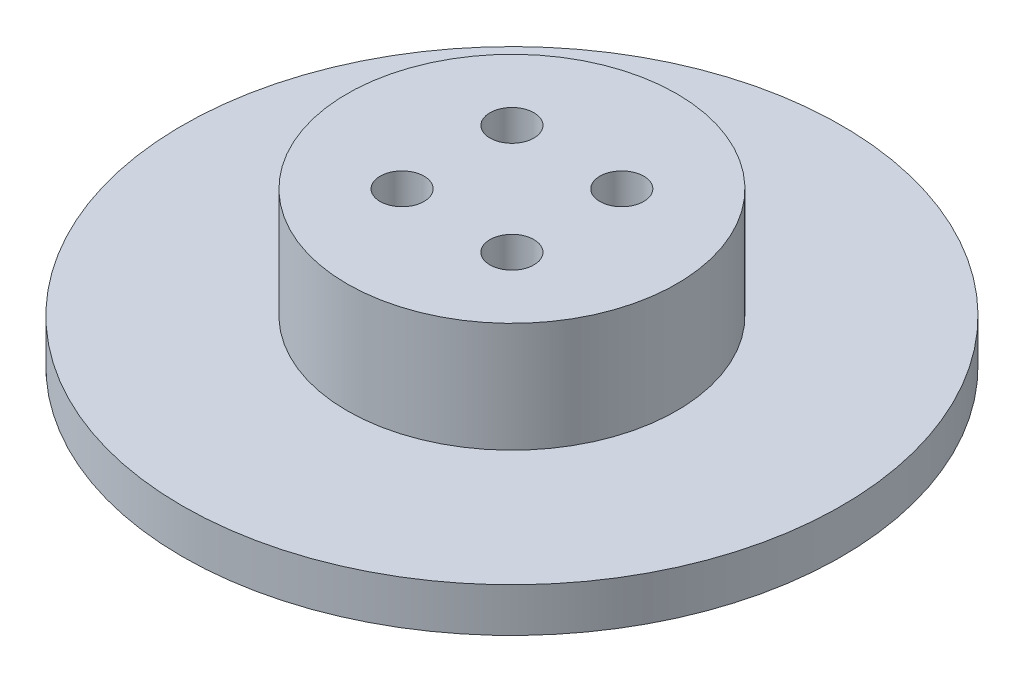
ISO-10303-21;
HEADER;
FILE_DESCRIPTION(('STEP AP214'),'2;1');
FILE_NAME('part.step','',(''),(''),'','','');
FILE_SCHEMA(('AUTOMOTIVE_DESIGN { 1 0 10303 214 1 1 1 1 }'));
ENDSEC;
DATA;
#1=APPLICATION_CONTEXT('core data for automotive mechanical design processes');
#2=APPLICATION_PROTOCOL_DEFINITION('international standard','automotive_design',2000,#1);
#3=PRODUCT_CONTEXT('',#1,'mechanical');
#4=PRODUCT('Part','Part','',(#3));
#5=PRODUCT_RELATED_PRODUCT_CATEGORY('part','',(#4));
#6=PRODUCT_DEFINITION_FORMATION('','',#4);
#7=PRODUCT_DEFINITION_CONTEXT('part definition',#1,'design');
#8=PRODUCT_DEFINITION('design','',#6,#7);
#9=PRODUCT_DEFINITION_SHAPE('','',#8);
#10=(LENGTH_UNIT() NAMED_UNIT(*) SI_UNIT(.MILLI.,.METRE.));
#11=(NAMED_UNIT(*) PLANE_ANGLE_UNIT() SI_UNIT($,.RADIAN.));
#12=(NAMED_UNIT(*) SI_UNIT($,.STERADIAN.) SOLID_ANGLE_UNIT());
#13=UNCERTAINTY_MEASURE_WITH_UNIT(LENGTH_MEASURE(1.E-05),#10,'distance_accuracy_value','');
#14=(GEOMETRIC_REPRESENTATION_CONTEXT(3) GLOBAL_UNCERTAINTY_ASSIGNED_CONTEXT((#13)) GLOBAL_UNIT_ASSIGNED_CONTEXT((#10,
#11,#12)) REPRESENTATION_CONTEXT('',''));
#15=CARTESIAN_POINT('',(0.,0.,0.));
#16=DIRECTION('',(0.,0.,1.));
#17=DIRECTION('',(1.,0.,0.));
#18=AXIS2_PLACEMENT_3D('',#15,#16,#17);
#19=CARTESIAN_POINT('',(0.,4.,0.));
#20=DIRECTION('',(0.,-1.,0.));
#21=DIRECTION('',(0.,0.,-1.));
#22=AXIS2_PLACEMENT_3D('',#19,#20,#21);
#23=CYLINDRICAL_SURFACE('',#22,30.);
#24=CARTESIAN_POINT('',(0.,4.,0.));
#25=DIRECTION('',(0.,1.,0.));
#26=DIRECTION('',(0.,0.,1.));
#27=AXIS2_PLACEMENT_3D('',#24,#25,#26);
#28=CIRCLE('',#27,30.);
#29=CARTESIAN_POINT('',(0.,4.,30.));
#30=VERTEX_POINT('',#29);
#31=EDGE_CURVE('E58',#30,#30,#28,.T.);
#32=ORIENTED_EDGE('',*,*,#31,.F.);
#33=EDGE_LOOP('',(#32));
#34=FACE_BOUND('',#33,.T.);
#35=CARTESIAN_POINT('',(0.,0.,0.));
#36=DIRECTION('',(0.,1.,0.));
#37=DIRECTION('',(0.,0.,1.));
#38=AXIS2_PLACEMENT_3D('',#35,#36,#37);
#39=CIRCLE('',#38,30.);
#40=CARTESIAN_POINT('',(0.,0.,30.));
#41=VERTEX_POINT('',#40);
#42=EDGE_CURVE('E55',#41,#41,#39,.T.);
#43=ORIENTED_EDGE('',*,*,#42,.T.);
#44=EDGE_LOOP('',(#43));
#45=FACE_BOUND('',#44,.T.);
#46=ADVANCED_FACE('F35',(#34,#45),#23,.T.);
#47=CARTESIAN_POINT('',(0.,4.,0.));
#48=DIRECTION('',(0.,1.,0.));
#49=DIRECTION('',(0.,0.,1.));
#50=AXIS2_PLACEMENT_3D('',#47,#48,#49);
#51=PLANE('',#50);
#52=CARTESIAN_POINT('',(0.,4.,0.));
#53=DIRECTION('',(0.,1.,0.));
#54=DIRECTION('',(0.,0.,1.));
#55=AXIS2_PLACEMENT_3D('',#52,#53,#54);
#56=CIRCLE('',#55,15.);
#57=CARTESIAN_POINT('',(0.,4.,15.));
#58=VERTEX_POINT('',#57);
#59=EDGE_CURVE('E54',#58,#58,#56,.T.);
#60=ORIENTED_EDGE('',*,*,#59,.F.);
#61=EDGE_LOOP('',(#60));
#62=FACE_BOUND('',#61,.T.);
#63=ORIENTED_EDGE('',*,*,#31,.T.);
#64=EDGE_LOOP('',(#63));
#65=FACE_BOUND('',#64,.T.);
#66=ADVANCED_FACE('F122',(#62,#65),#51,.T.);
#67=CARTESIAN_POINT('',(0.,0.,0.));
#68=DIRECTION('',(0.,1.,0.));
#69=DIRECTION('',(0.,0.,1.));
#70=AXIS2_PLACEMENT_3D('',#67,#68,#69);
#71=PLANE('',#70);
#72=CARTESIAN_POINT('',(-2.16105686929803E-13,0.,-21.));
#73=DIRECTION('',(0.,1.,0.));
#74=DIRECTION('',(0.,0.,1.));
#75=AXIS2_PLACEMENT_3D('',#72,#73,#74);
#76=CIRCLE('',#75,3.);
#77=CARTESIAN_POINT('',(-2.16105686929803E-13,0.,-18.));
#78=VERTEX_POINT('',#77);
#79=EDGE_CURVE('E10',#78,#78,#76,.F.);
#80=ORIENTED_EDGE('',*,*,#79,.F.);
#81=EDGE_LOOP('',(#80));
#82=FACE_BOUND('',#81,.T.);
#83=CARTESIAN_POINT('',(21.,0.,-1.42784578814097E-13));
#84=DIRECTION('',(0.,1.,0.));
#85=DIRECTION('',(0.,0.,1.));
#86=AXIS2_PLACEMENT_3D('',#83,#84,#85);
#87=CIRCLE('',#86,3.);
#88=CARTESIAN_POINT('',(21.,0.,2.99999999999985));
#89=VERTEX_POINT('',#88);
#90=EDGE_CURVE('E41',#89,#89,#87,.F.);
#91=ORIENTED_EDGE('',*,*,#90,.F.);
#92=EDGE_LOOP('',(#91));
#93=FACE_BOUND('',#92,.T.);
#94=CARTESIAN_POINT('',(0.,0.,21.));
#95=DIRECTION('',(0.,1.,0.));
#96=DIRECTION('',(0.,0.,1.));
#97=AXIS2_PLACEMENT_3D('',#94,#95,#96);
#98=CIRCLE('',#97,3.);
#99=CARTESIAN_POINT('',(0.,0.,24.));
#100=VERTEX_POINT('',#99);
#101=EDGE_CURVE('E45',#100,#100,#98,.F.);
#102=ORIENTED_EDGE('',*,*,#101,.F.);
#103=EDGE_LOOP('',(#102));
#104=FACE_BOUND('',#103,.T.);
#105=CARTESIAN_POINT('',(-21.,0.,0.));
#106=DIRECTION('',(0.,1.,0.));
#107=DIRECTION('',(0.,0.,1.));
#108=AXIS2_PLACEMENT_3D('',#105,#106,#107);
#109=CIRCLE('',#108,3.);
#110=CARTESIAN_POINT('',(-21.,0.,2.99999999999999));
#111=VERTEX_POINT('',#110);
#112=EDGE_CURVE('E49',#111,#111,#109,.F.);
#113=ORIENTED_EDGE('',*,*,#112,.F.);
#114=EDGE_LOOP('',(#113));
#115=FACE_BOUND('',#114,.T.);
#116=ORIENTED_EDGE('',*,*,#42,.F.);
#117=EDGE_LOOP('',(#116));
#118=FACE_BOUND('',#117,.T.);
#119=ADVANCED_FACE('F118',(#82,#93,#104,#115,#118),#71,.F.);
#120=CARTESIAN_POINT('',(0.,14.,0.));
#121=DIRECTION('',(0.,-1.,0.));
#122=DIRECTION('',(0.,0.,-1.));
#123=AXIS2_PLACEMENT_3D('',#120,#121,#122);
#124=CYLINDRICAL_SURFACE('',#123,15.);
#125=CARTESIAN_POINT('',(0.,14.,0.));
#126=DIRECTION('',(0.,1.,0.));
#127=DIRECTION('',(0.,0.,1.));
#128=AXIS2_PLACEMENT_3D('',#125,#126,#127);
#129=CIRCLE('',#128,15.);
#130=CARTESIAN_POINT('',(0.,14.,15.));
#131=VERTEX_POINT('',#130);
#132=EDGE_CURVE('E59',#131,#131,#129,.T.);
#133=ORIENTED_EDGE('',*,*,#132,.F.);
#134=EDGE_LOOP('',(#133));
#135=FACE_BOUND('',#134,.T.);
#136=ORIENTED_EDGE('',*,*,#59,.T.);
#137=EDGE_LOOP('',(#136));
#138=FACE_BOUND('',#137,.T.);
#139=ADVANCED_FACE('F109',(#135,#138),#124,.T.);
#140=CARTESIAN_POINT('',(0.,14.,0.));
#141=DIRECTION('',(0.,1.,0.));
#142=DIRECTION('',(0.,0.,1.));
#143=AXIS2_PLACEMENT_3D('',#140,#141,#142);
#144=PLANE('',#143);
#145=CARTESIAN_POINT('',(-5.,14.,5.));
#146=DIRECTION('',(0.,1.,0.));
#147=DIRECTION('',(0.,0.,1.));
#148=AXIS2_PLACEMENT_3D('',#145,#146,#147);
#149=CIRCLE('',#148,2.);
#150=CARTESIAN_POINT('',(-5.,14.,7.));
#151=VERTEX_POINT('',#150);
#152=EDGE_CURVE('E88',#151,#151,#149,.T.);
#153=ORIENTED_EDGE('',*,*,#152,.F.);
#154=EDGE_LOOP('',(#153));
#155=FACE_BOUND('',#154,.T.);
#156=CARTESIAN_POINT('',(5.,14.,5.));
#157=DIRECTION('',(0.,1.,0.));
#158=DIRECTION('',(0.,0.,1.));
#159=AXIS2_PLACEMENT_3D('',#156,#157,#158);
#160=CIRCLE('',#159,2.);
#161=CARTESIAN_POINT('',(5.,14.,7.));
#162=VERTEX_POINT('',#161);
#163=EDGE_CURVE('E94',#162,#162,#160,.T.);
#164=ORIENTED_EDGE('',*,*,#163,.F.);
#165=EDGE_LOOP('',(#164));
#166=FACE_BOUND('',#165,.T.);
#167=CARTESIAN_POINT('',(5.,14.,-5.));
#168=DIRECTION('',(0.,1.,0.));
#169=DIRECTION('',(0.,0.,1.));
#170=AXIS2_PLACEMENT_3D('',#167,#168,#169);
#171=CIRCLE('',#170,2.);
#172=CARTESIAN_POINT('',(5.,14.,-3.));
#173=VERTEX_POINT('',#172);
#174=EDGE_CURVE('E82',#173,#173,#171,.T.);
#175=ORIENTED_EDGE('',*,*,#174,.F.);
#176=EDGE_LOOP('',(#175));
#177=FACE_BOUND('',#176,.T.);
#178=CARTESIAN_POINT('',(-5.,14.,-5.));
#179=DIRECTION('',(0.,1.,0.));
#180=DIRECTION('',(0.,0.,1.));
#181=AXIS2_PLACEMENT_3D('',#178,#179,#180);
#182=CIRCLE('',#181,2.);
#183=CARTESIAN_POINT('',(-5.,14.,-3.));
#184=VERTEX_POINT('',#183);
#185=EDGE_CURVE('E79',#184,#184,#182,.T.);
#186=ORIENTED_EDGE('',*,*,#185,.F.);
#187=EDGE_LOOP('',(#186));
#188=FACE_BOUND('',#187,.T.);
#189=ORIENTED_EDGE('',*,*,#132,.T.);
#190=EDGE_LOOP('',(#189));
#191=FACE_BOUND('',#190,.T.);
#192=ADVANCED_FACE('F105',(#155,#166,#177,#188,#191),#144,.T.);
#193=CARTESIAN_POINT('',(-21.,-4.,0.));
#194=DIRECTION('',(0.,1.,0.));
#195=DIRECTION('',(0.,0.,1.));
#196=AXIS2_PLACEMENT_3D('',#193,#194,#195);
#197=CYLINDRICAL_SURFACE('',#196,3.);
#198=CARTESIAN_POINT('',(-21.,-4.,0.));
#199=DIRECTION('',(0.,-1.,0.));
#200=DIRECTION('',(0.,0.,-1.));
#201=AXIS2_PLACEMENT_3D('',#198,#199,#200);
#202=CIRCLE('',#201,3.);
#203=CARTESIAN_POINT('',(-21.,-4.,-3.));
#204=VERTEX_POINT('',#203);
#205=EDGE_CURVE('E66',#204,#204,#202,.T.);
#206=ORIENTED_EDGE('',*,*,#205,.F.);
#207=EDGE_LOOP('',(#206));
#208=FACE_BOUND('',#207,.T.);
#209=ORIENTED_EDGE('',*,*,#112,.T.);
#210=EDGE_LOOP('',(#209));
#211=FACE_BOUND('',#210,.T.);
#212=ADVANCED_FACE('F108',(#208,#211),#197,.T.);
#213=CARTESIAN_POINT('',(-21.,-4.,0.));
#214=DIRECTION('',(0.,-1.,0.));
#215=DIRECTION('',(0.,0.,-1.));
#216=AXIS2_PLACEMENT_3D('',#213,#214,#215);
#217=PLANE('',#216);
#218=ORIENTED_EDGE('',*,*,#205,.T.);
#219=EDGE_LOOP('',(#218));
#220=FACE_BOUND('',#219,.T.);
#221=ADVANCED_FACE('F140',(#220),#217,.T.);
#222=CARTESIAN_POINT('',(0.,-4.,21.));
#223=DIRECTION('',(0.,1.,0.));
#224=DIRECTION('',(0.,0.,1.));
#225=AXIS2_PLACEMENT_3D('',#222,#223,#224);
#226=CYLINDRICAL_SURFACE('',#225,3.);
#227=CARTESIAN_POINT('',(0.,-4.,21.));
#228=DIRECTION('',(0.,-1.,0.));
#229=DIRECTION('',(0.,0.,-1.));
#230=AXIS2_PLACEMENT_3D('',#227,#228,#229);
#231=CIRCLE('',#230,3.);
#232=CARTESIAN_POINT('',(0.,-4.,18.));
#233=VERTEX_POINT('',#232);
#234=EDGE_CURVE('E69',#233,#233,#231,.T.);
#235=ORIENTED_EDGE('',*,*,#234,.F.);
#236=EDGE_LOOP('',(#235));
#237=FACE_BOUND('',#236,.T.);
#238=ORIENTED_EDGE('',*,*,#101,.T.);
#239=EDGE_LOOP('',(#238));
#240=FACE_BOUND('',#239,.T.);
#241=ADVANCED_FACE('F144',(#237,#240),#226,.T.);
#242=CARTESIAN_POINT('',(0.,-4.,21.));
#243=DIRECTION('',(0.,-1.,0.));
#244=DIRECTION('',(0.,0.,-1.));
#245=AXIS2_PLACEMENT_3D('',#242,#243,#244);
#246=PLANE('',#245);
#247=ORIENTED_EDGE('',*,*,#234,.T.);
#248=EDGE_LOOP('',(#247));
#249=FACE_BOUND('',#248,.T.);
#250=ADVANCED_FACE('F146',(#249),#246,.T.);
#251=CARTESIAN_POINT('',(21.,-4.,-1.42784578814097E-13));
#252=DIRECTION('',(0.,1.,0.));
#253=DIRECTION('',(0.,0.,1.));
#254=AXIS2_PLACEMENT_3D('',#251,#252,#253);
#255=CYLINDRICAL_SURFACE('',#254,3.);
#256=CARTESIAN_POINT('',(21.,-4.,-1.42784578814097E-13));
#257=DIRECTION('',(0.,-1.,0.));
#258=DIRECTION('',(0.,0.,-1.));
#259=AXIS2_PLACEMENT_3D('',#256,#257,#258);
#260=CIRCLE('',#259,3.);
#261=CARTESIAN_POINT('',(21.,-4.,-3.00000000000014));
#262=VERTEX_POINT('',#261);
#263=EDGE_CURVE('E72',#262,#262,#260,.T.);
#264=ORIENTED_EDGE('',*,*,#263,.F.);
#265=EDGE_LOOP('',(#264));
#266=FACE_BOUND('',#265,.T.);
#267=ORIENTED_EDGE('',*,*,#90,.T.);
#268=EDGE_LOOP('',(#267));
#269=FACE_BOUND('',#268,.T.);
#270=ADVANCED_FACE('F149',(#266,#269),#255,.T.);
#271=CARTESIAN_POINT('',(21.,-4.,-1.42784578814097E-13));
#272=DIRECTION('',(0.,-1.,0.));
#273=DIRECTION('',(0.,0.,-1.));
#274=AXIS2_PLACEMENT_3D('',#271,#272,#273);
#275=PLANE('',#274);
#276=ORIENTED_EDGE('',*,*,#263,.T.);
#277=EDGE_LOOP('',(#276));
#278=FACE_BOUND('',#277,.T.);
#279=ADVANCED_FACE('F154',(#278),#275,.T.);
#280=CARTESIAN_POINT('',(-2.16105686929803E-13,-4.,-21.));
#281=DIRECTION('',(0.,1.,0.));
#282=DIRECTION('',(0.,0.,1.));
#283=AXIS2_PLACEMENT_3D('',#280,#281,#282);
#284=CYLINDRICAL_SURFACE('',#283,3.);
#285=CARTESIAN_POINT('',(-2.16105686929803E-13,-4.,-21.));
#286=DIRECTION('',(0.,-1.,0.));
#287=DIRECTION('',(0.,0.,-1.));
#288=AXIS2_PLACEMENT_3D('',#285,#286,#287);
#289=CIRCLE('',#288,3.);
#290=CARTESIAN_POINT('',(-2.16105686929803E-13,-4.,-24.));
#291=VERTEX_POINT('',#290);
#292=EDGE_CURVE('E75',#291,#291,#289,.T.);
#293=ORIENTED_EDGE('',*,*,#292,.F.);
#294=EDGE_LOOP('',(#293));
#295=FACE_BOUND('',#294,.T.);
#296=ORIENTED_EDGE('',*,*,#79,.T.);
#297=EDGE_LOOP('',(#296));
#298=FACE_BOUND('',#297,.T.);
#299=ADVANCED_FACE('F157',(#295,#298),#284,.T.);
#300=CARTESIAN_POINT('',(-2.16105686929803E-13,-4.,-21.));
#301=DIRECTION('',(0.,-1.,0.));
#302=DIRECTION('',(0.,0.,-1.));
#303=AXIS2_PLACEMENT_3D('',#300,#301,#302);
#304=PLANE('',#303);
#305=ORIENTED_EDGE('',*,*,#292,.T.);
#306=EDGE_LOOP('',(#305));
#307=FACE_BOUND('',#306,.T.);
#308=ADVANCED_FACE('F162',(#307),#304,.T.);
#309=CARTESIAN_POINT('',(-5.,10.,-5.));
#310=DIRECTION('',(0.,1.,0.));
#311=DIRECTION('',(0.,0.,1.));
#312=AXIS2_PLACEMENT_3D('',#309,#310,#311);
#313=CYLINDRICAL_SURFACE('',#312,2.);
#314=CARTESIAN_POINT('',(-5.,10.,-5.));
#315=DIRECTION('',(0.,1.,0.));
#316=DIRECTION('',(0.,0.,1.));
#317=AXIS2_PLACEMENT_3D('',#314,#315,#316);
#318=CIRCLE('',#317,2.);
#319=CARTESIAN_POINT('',(-5.,10.,-3.));
#320=VERTEX_POINT('',#319);
#321=EDGE_CURVE('E78',#320,#320,#318,.T.);
#322=ORIENTED_EDGE('',*,*,#321,.F.);
#323=EDGE_LOOP('',(#322));
#324=FACE_BOUND('',#323,.T.);
#325=ORIENTED_EDGE('',*,*,#185,.T.);
#326=EDGE_LOOP('',(#325));
#327=FACE_BOUND('',#326,.T.);
#328=ADVANCED_FACE('F165',(#324,#327),#313,.F.);
#329=CARTESIAN_POINT('',(-5.,10.,-5.));
#330=DIRECTION('',(0.,1.,0.));
#331=DIRECTION('',(0.,0.,1.));
#332=AXIS2_PLACEMENT_3D('',#329,#330,#331);
#333=PLANE('',#332);
#334=ORIENTED_EDGE('',*,*,#321,.T.);
#335=EDGE_LOOP('',(#334));
#336=FACE_BOUND('',#335,.T.);
#337=ADVANCED_FACE('F172',(#336),#333,.T.);
#338=CARTESIAN_POINT('',(5.,10.,-5.));
#339=DIRECTION('',(0.,1.,0.));
#340=DIRECTION('',(0.,0.,1.));
#341=AXIS2_PLACEMENT_3D('',#338,#339,#340);
#342=CYLINDRICAL_SURFACE('',#341,2.);
#343=CARTESIAN_POINT('',(5.,10.,-5.));
#344=DIRECTION('',(0.,1.,0.));
#345=DIRECTION('',(0.,0.,1.));
#346=AXIS2_PLACEMENT_3D('',#343,#344,#345);
#347=CIRCLE('',#346,2.);
#348=CARTESIAN_POINT('',(5.,10.,-3.));
#349=VERTEX_POINT('',#348);
#350=EDGE_CURVE('E97',#349,#349,#347,.T.);
#351=ORIENTED_EDGE('',*,*,#350,.F.);
#352=EDGE_LOOP('',(#351));
#353=FACE_BOUND('',#352,.T.);
#354=ORIENTED_EDGE('',*,*,#174,.T.);
#355=EDGE_LOOP('',(#354));
#356=FACE_BOUND('',#355,.T.);
#357=ADVANCED_FACE('F103',(#353,#356),#342,.F.);
#358=CARTESIAN_POINT('',(5.,10.,-5.));
#359=DIRECTION('',(0.,1.,0.));
#360=DIRECTION('',(0.,0.,1.));
#361=AXIS2_PLACEMENT_3D('',#358,#359,#360);
#362=PLANE('',#361);
#363=ORIENTED_EDGE('',*,*,#350,.T.);
#364=EDGE_LOOP('',(#363));
#365=FACE_BOUND('',#364,.T.);
#366=ADVANCED_FACE('F192',(#365),#362,.T.);
#367=CARTESIAN_POINT('',(5.,10.,5.));
#368=DIRECTION('',(0.,1.,0.));
#369=DIRECTION('',(0.,0.,1.));
#370=AXIS2_PLACEMENT_3D('',#367,#368,#369);
#371=CYLINDRICAL_SURFACE('',#370,2.);
#372=CARTESIAN_POINT('',(5.,10.,5.));
#373=DIRECTION('',(0.,1.,0.));
#374=DIRECTION('',(0.,0.,1.));
#375=AXIS2_PLACEMENT_3D('',#372,#373,#374);
#376=CIRCLE('',#375,2.);
#377=CARTESIAN_POINT('',(5.,10.,7.));
#378=VERTEX_POINT('',#377);
#379=EDGE_CURVE('E91',#378,#378,#376,.T.);
#380=ORIENTED_EDGE('',*,*,#379,.F.);
#381=EDGE_LOOP('',(#380));
#382=FACE_BOUND('',#381,.T.);
#383=ORIENTED_EDGE('',*,*,#163,.T.);
#384=EDGE_LOOP('',(#383));
#385=FACE_BOUND('',#384,.T.);
#386=ADVANCED_FACE('F188',(#382,#385),#371,.F.);
#387=CARTESIAN_POINT('',(5.,10.,5.));
#388=DIRECTION('',(0.,1.,0.));
#389=DIRECTION('',(0.,0.,1.));
#390=AXIS2_PLACEMENT_3D('',#387,#388,#389);
#391=PLANE('',#390);
#392=ORIENTED_EDGE('',*,*,#379,.T.);
#393=EDGE_LOOP('',(#392));
#394=FACE_BOUND('',#393,.T.);
#395=ADVANCED_FACE('F184',(#394),#391,.T.);
#396=CARTESIAN_POINT('',(-5.,10.,5.));
#397=DIRECTION('',(0.,1.,0.));
#398=DIRECTION('',(0.,0.,1.));
#399=AXIS2_PLACEMENT_3D('',#396,#397,#398);
#400=CYLINDRICAL_SURFACE('',#399,2.);
#401=CARTESIAN_POINT('',(-5.,10.,5.));
#402=DIRECTION('',(0.,1.,0.));
#403=DIRECTION('',(0.,0.,1.));
#404=AXIS2_PLACEMENT_3D('',#401,#402,#403);
#405=CIRCLE('',#404,2.);
#406=CARTESIAN_POINT('',(-5.,10.,7.));
#407=VERTEX_POINT('',#406);
#408=EDGE_CURVE('E85',#407,#407,#405,.T.);
#409=ORIENTED_EDGE('',*,*,#408,.F.);
#410=EDGE_LOOP('',(#409));
#411=FACE_BOUND('',#410,.T.);
#412=ORIENTED_EDGE('',*,*,#152,.T.);
#413=EDGE_LOOP('',(#412));
#414=FACE_BOUND('',#413,.T.);
#415=ADVANCED_FACE('F180',(#411,#414),#400,.F.);
#416=CARTESIAN_POINT('',(-5.,10.,5.));
#417=DIRECTION('',(0.,1.,0.));
#418=DIRECTION('',(0.,0.,1.));
#419=AXIS2_PLACEMENT_3D('',#416,#417,#418);
#420=PLANE('',#419);
#421=ORIENTED_EDGE('',*,*,#408,.T.);
#422=EDGE_LOOP('',(#421));
#423=FACE_BOUND('',#422,.T.);
#424=ADVANCED_FACE('F177',(#423),#420,.T.);
#425=CLOSED_SHELL('',(#46,#66,#119,#139,#192,#212,#221,#241,#250,#270,#279,#299,#308,#328,#337,
#357,#366,#386,#395,#415,#424));
#426=MANIFOLD_SOLID_BREP('B2',#425);
#427=ADVANCED_BREP_SHAPE_REPRESENTATION('',(#18,#426),#14);
#428=SHAPE_DEFINITION_REPRESENTATION(#9,#427);
ENDSEC;
END-ISO-10303-21;
